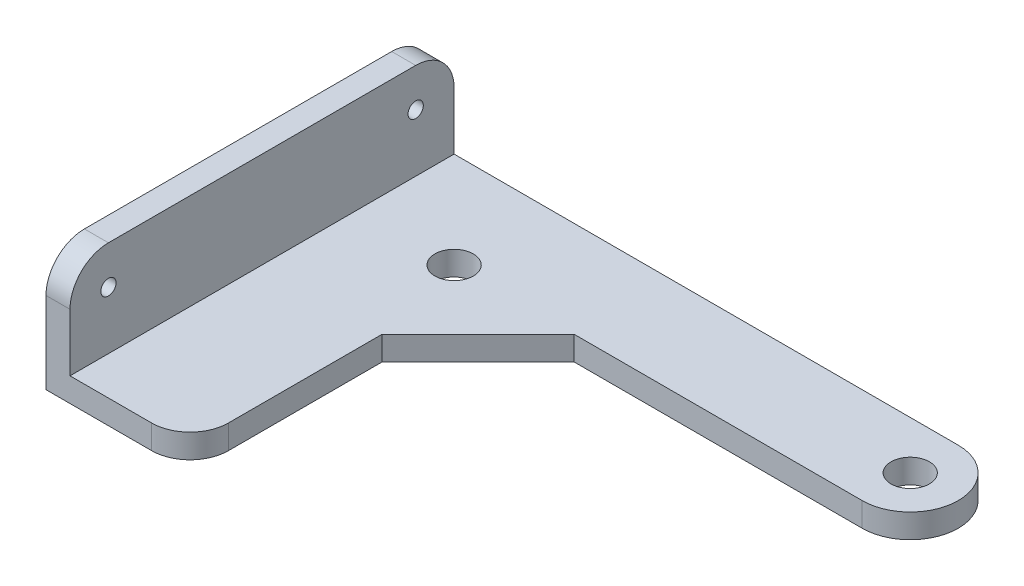
ISO-10303-21;
HEADER;
FILE_DESCRIPTION(('STEP AP214'),'2;1');
FILE_NAME('part.step','',(''),(''),'','','');
FILE_SCHEMA(('AUTOMOTIVE_DESIGN { 1 0 10303 214 1 1 1 1 }'));
ENDSEC;
DATA;
#1=APPLICATION_CONTEXT('core data for automotive mechanical design processes');
#2=APPLICATION_PROTOCOL_DEFINITION('international standard','automotive_design',2000,#1);
#3=PRODUCT_CONTEXT('',#1,'mechanical');
#4=PRODUCT('Part','Part','',(#3));
#5=PRODUCT_RELATED_PRODUCT_CATEGORY('part','',(#4));
#6=PRODUCT_DEFINITION_FORMATION('','',#4);
#7=PRODUCT_DEFINITION_CONTEXT('part definition',#1,'design');
#8=PRODUCT_DEFINITION('design','',#6,#7);
#9=PRODUCT_DEFINITION_SHAPE('','',#8);
#10=(LENGTH_UNIT() NAMED_UNIT(*) SI_UNIT(.MILLI.,.METRE.));
#11=(NAMED_UNIT(*) PLANE_ANGLE_UNIT() SI_UNIT($,.RADIAN.));
#12=(NAMED_UNIT(*) SI_UNIT($,.STERADIAN.) SOLID_ANGLE_UNIT());
#13=UNCERTAINTY_MEASURE_WITH_UNIT(LENGTH_MEASURE(1.E-05),#10,'distance_accuracy_value','');
#14=(GEOMETRIC_REPRESENTATION_CONTEXT(3) GLOBAL_UNCERTAINTY_ASSIGNED_CONTEXT((#13)) GLOBAL_UNIT_ASSIGNED_CONTEXT((#10,
#11,#12)) REPRESENTATION_CONTEXT('',''));
#15=CARTESIAN_POINT('',(0.,0.,0.));
#16=DIRECTION('',(0.,0.,1.));
#17=DIRECTION('',(1.,0.,0.));
#18=AXIS2_PLACEMENT_3D('',#15,#16,#17);
#19=CARTESIAN_POINT('',(0.,25.,-300.));
#20=DIRECTION('',(0.,0.,-1.));
#21=DIRECTION('',(-1.,0.,0.));
#22=AXIS2_PLACEMENT_3D('',#19,#20,#21);
#23=PLANE('',#22);
#24=DIRECTION('',(1.,0.,0.));
#25=VECTOR('',#24,1.);
#26=CARTESIAN_POINT('',(0.,0.,-300.));
#27=LINE('',#26,#25);
#28=CARTESIAN_POINT('',(250.,0.,-300.));
#29=VERTEX_POINT('',#28);
#30=CARTESIAN_POINT('',(550.,0.,-300.));
#31=VERTEX_POINT('',#30);
#32=EDGE_CURVE('E165',#29,#31,#27,.T.);
#33=ORIENTED_EDGE('',*,*,#32,.T.);
#34=DIRECTION('',(0.,-1.,0.));
#35=VECTOR('',#34,1.);
#36=CARTESIAN_POINT('',(550.,25.,-300.));
#37=LINE('',#36,#35);
#38=CARTESIAN_POINT('',(550.,25.,-300.));
#39=VERTEX_POINT('',#38);
#40=EDGE_CURVE('E198',#39,#31,#37,.T.);
#41=ORIENTED_EDGE('',*,*,#40,.F.);
#42=DIRECTION('',(1.,0.,0.));
#43=VECTOR('',#42,1.);
#44=CARTESIAN_POINT('',(0.,25.,-300.));
#45=LINE('',#44,#43);
#46=CARTESIAN_POINT('',(250.,25.,-300.));
#47=VERTEX_POINT('',#46);
#48=EDGE_CURVE('E166',#47,#39,#45,.T.);
#49=ORIENTED_EDGE('',*,*,#48,.F.);
#50=DIRECTION('',(0.,-1.,0.));
#51=VECTOR('',#50,1.);
#52=CARTESIAN_POINT('',(250.,25.,-300.));
#53=LINE('',#52,#51);
#54=EDGE_CURVE('E184',#47,#29,#53,.T.);
#55=ORIENTED_EDGE('',*,*,#54,.T.);
#56=EDGE_LOOP('',(#33,#41,#49,#55));
#57=FACE_BOUND('',#56,.T.);
#58=ADVANCED_FACE('F36',(#57),#23,.F.);
#59=CARTESIAN_POINT('',(550.,25.,-350.));
#60=DIRECTION('',(0.,-1.,0.));
#61=DIRECTION('',(0.,0.,-1.));
#62=AXIS2_PLACEMENT_3D('',#59,#60,#61);
#63=CYLINDRICAL_SURFACE('',#62,50.);
#64=CARTESIAN_POINT('',(550.,0.,-350.));
#65=DIRECTION('',(0.,1.,0.));
#66=DIRECTION('',(0.,0.,1.));
#67=AXIS2_PLACEMENT_3D('',#64,#65,#66);
#68=CIRCLE('',#67,50.);
#69=CARTESIAN_POINT('',(550.,0.,-400.));
#70=VERTEX_POINT('',#69);
#71=EDGE_CURVE('E144',#70,#31,#68,.F.);
#72=ORIENTED_EDGE('',*,*,#71,.F.);
#73=DIRECTION('',(0.,-1.,0.));
#74=VECTOR('',#73,1.);
#75=CARTESIAN_POINT('',(550.,25.,-400.));
#76=LINE('',#75,#74);
#77=CARTESIAN_POINT('',(550.,25.,-400.));
#78=VERTEX_POINT('',#77);
#79=EDGE_CURVE('E139',#78,#70,#76,.T.);
#80=ORIENTED_EDGE('',*,*,#79,.F.);
#81=CARTESIAN_POINT('',(550.,25.,-350.));
#82=DIRECTION('',(0.,1.,0.));
#83=DIRECTION('',(0.,0.,1.));
#84=AXIS2_PLACEMENT_3D('',#81,#82,#83);
#85=CIRCLE('',#84,50.);
#86=EDGE_CURVE('E168',#78,#39,#85,.F.);
#87=ORIENTED_EDGE('',*,*,#86,.T.);
#88=ORIENTED_EDGE('',*,*,#40,.T.);
#89=EDGE_LOOP('',(#72,#80,#87,#88));
#90=FACE_BOUND('',#89,.T.);
#91=ADVANCED_FACE('F252',(#90),#63,.T.);
#92=CARTESIAN_POINT('',(0.,25.,-400.));
#93=DIRECTION('',(0.,0.,-1.));
#94=DIRECTION('',(-1.,0.,0.));
#95=AXIS2_PLACEMENT_3D('',#92,#93,#94);
#96=PLANE('',#95);
#97=DIRECTION('',(0.,-1.,0.));
#98=VECTOR('',#97,1.);
#99=CARTESIAN_POINT('',(0.,125.,-400.));
#100=LINE('',#99,#98);
#101=CARTESIAN_POINT('',(0.,85.,-400.));
#102=VERTEX_POINT('',#101);
#103=CARTESIAN_POINT('',(0.,0.,-400.));
#104=VERTEX_POINT('',#103);
#105=EDGE_CURVE('E125',#102,#104,#100,.T.);
#106=ORIENTED_EDGE('',*,*,#105,.F.);
#107=DIRECTION('',(1.,0.,0.));
#108=VECTOR('',#107,1.);
#109=CARTESIAN_POINT('',(0.,85.,-400.));
#110=LINE('',#109,#108);
#111=CARTESIAN_POINT('',(25.,85.,-400.));
#112=VERTEX_POINT('',#111);
#113=EDGE_CURVE('E11',#102,#112,#110,.T.);
#114=ORIENTED_EDGE('',*,*,#113,.T.);
#115=DIRECTION('',(0.,-1.,0.));
#116=VECTOR('',#115,1.);
#117=CARTESIAN_POINT('',(25.,125.,-400.));
#118=LINE('',#117,#116);
#119=CARTESIAN_POINT('',(25.,25.,-400.));
#120=VERTEX_POINT('',#119);
#121=EDGE_CURVE('E132',#112,#120,#118,.T.);
#122=ORIENTED_EDGE('',*,*,#121,.T.);
#123=DIRECTION('',(1.,0.,0.));
#124=VECTOR('',#123,1.);
#125=CARTESIAN_POINT('',(0.,25.,-400.));
#126=LINE('',#125,#124);
#127=EDGE_CURVE('E172',#120,#78,#126,.T.);
#128=ORIENTED_EDGE('',*,*,#127,.T.);
#129=ORIENTED_EDGE('',*,*,#79,.T.);
#130=DIRECTION('',(1.,0.,0.));
#131=VECTOR('',#130,1.);
#132=CARTESIAN_POINT('',(0.,0.,-400.));
#133=LINE('',#132,#131);
#134=EDGE_CURVE('E136',#104,#70,#133,.T.);
#135=ORIENTED_EDGE('',*,*,#134,.F.);
#136=EDGE_LOOP('',(#106,#114,#122,#128,#129,#135));
#137=FACE_BOUND('',#136,.T.);
#138=ADVANCED_FACE('F137',(#137),#96,.T.);
#139=CARTESIAN_POINT('',(0.,25.,0.));
#140=DIRECTION('',(0.,0.,-1.));
#141=DIRECTION('',(-1.,0.,0.));
#142=AXIS2_PLACEMENT_3D('',#139,#140,#141);
#143=PLANE('',#142);
#144=DIRECTION('',(0.,-1.,0.));
#145=VECTOR('',#144,1.);
#146=CARTESIAN_POINT('',(25.,125.,0.));
#147=LINE('',#146,#145);
#148=CARTESIAN_POINT('',(25.,85.,0.));
#149=VERTEX_POINT('',#148);
#150=CARTESIAN_POINT('',(25.,25.,0.));
#151=VERTEX_POINT('',#150);
#152=EDGE_CURVE('E163',#149,#151,#147,.T.);
#153=ORIENTED_EDGE('',*,*,#152,.F.);
#154=DIRECTION('',(1.,0.,0.));
#155=VECTOR('',#154,1.);
#156=CARTESIAN_POINT('',(0.,85.,0.));
#157=LINE('',#156,#155);
#158=CARTESIAN_POINT('',(0.,85.,0.));
#159=VERTEX_POINT('',#158);
#160=EDGE_CURVE('E59',#149,#159,#157,.F.);
#161=ORIENTED_EDGE('',*,*,#160,.T.);
#162=DIRECTION('',(0.,-1.,0.));
#163=VECTOR('',#162,1.);
#164=CARTESIAN_POINT('',(0.,125.,0.));
#165=LINE('',#164,#163);
#166=CARTESIAN_POINT('',(0.,0.,0.));
#167=VERTEX_POINT('',#166);
#168=EDGE_CURVE('E133',#159,#167,#165,.T.);
#169=ORIENTED_EDGE('',*,*,#168,.T.);
#170=DIRECTION('',(1.,0.,0.));
#171=VECTOR('',#170,1.);
#172=CARTESIAN_POINT('',(0.,0.,0.));
#173=LINE('',#172,#171);
#174=CARTESIAN_POINT('',(110.,0.,0.));
#175=VERTEX_POINT('',#174);
#176=EDGE_CURVE('E143',#167,#175,#173,.T.);
#177=ORIENTED_EDGE('',*,*,#176,.T.);
#178=DIRECTION('',(0.,-1.,0.));
#179=VECTOR('',#178,1.);
#180=CARTESIAN_POINT('',(110.,25.,0.));
#181=LINE('',#180,#179);
#182=CARTESIAN_POINT('',(110.,25.,0.));
#183=VERTEX_POINT('',#182);
#184=EDGE_CURVE('E205',#175,#183,#181,.F.);
#185=ORIENTED_EDGE('',*,*,#184,.T.);
#186=DIRECTION('',(1.,0.,0.));
#187=VECTOR('',#186,1.);
#188=CARTESIAN_POINT('',(0.,25.,0.));
#189=LINE('',#188,#187);
#190=EDGE_CURVE('E177',#151,#183,#189,.T.);
#191=ORIENTED_EDGE('',*,*,#190,.F.);
#192=EDGE_LOOP('',(#153,#161,#169,#177,#185,#191));
#193=FACE_BOUND('',#192,.T.);
#194=ADVANCED_FACE('F231',(#193),#143,.F.);
#195=CARTESIAN_POINT('',(150.,25.,0.));
#196=DIRECTION('',(-1.,0.,0.));
#197=DIRECTION('',(0.,0.,1.));
#198=AXIS2_PLACEMENT_3D('',#195,#196,#197);
#199=PLANE('',#198);
#200=DIRECTION('',(0.,0.,-1.));
#201=VECTOR('',#200,1.);
#202=CARTESIAN_POINT('',(150.,25.,0.));
#203=LINE('',#202,#201);
#204=CARTESIAN_POINT('',(150.,25.,-40.));
#205=VERTEX_POINT('',#204);
#206=CARTESIAN_POINT('',(150.,25.,-200.));
#207=VERTEX_POINT('',#206);
#208=EDGE_CURVE('E180',#205,#207,#203,.T.);
#209=ORIENTED_EDGE('',*,*,#208,.F.);
#210=DIRECTION('',(0.,-1.,0.));
#211=VECTOR('',#210,1.);
#212=CARTESIAN_POINT('',(150.,25.,-40.));
#213=LINE('',#212,#211);
#214=CARTESIAN_POINT('',(150.,0.,-40.));
#215=VERTEX_POINT('',#214);
#216=EDGE_CURVE('E200',#205,#215,#213,.T.);
#217=ORIENTED_EDGE('',*,*,#216,.T.);
#218=DIRECTION('',(0.,0.,-1.));
#219=VECTOR('',#218,1.);
#220=CARTESIAN_POINT('',(150.,0.,0.));
#221=LINE('',#220,#219);
#222=CARTESIAN_POINT('',(150.,0.,-200.));
#223=VERTEX_POINT('',#222);
#224=EDGE_CURVE('E189',#215,#223,#221,.T.);
#225=ORIENTED_EDGE('',*,*,#224,.T.);
#226=DIRECTION('',(0.,-1.,0.));
#227=VECTOR('',#226,1.);
#228=CARTESIAN_POINT('',(150.,25.,-200.));
#229=LINE('',#228,#227);
#230=EDGE_CURVE('E194',#207,#223,#229,.T.);
#231=ORIENTED_EDGE('',*,*,#230,.F.);
#232=EDGE_LOOP('',(#209,#217,#225,#231));
#233=FACE_BOUND('',#232,.T.);
#234=ADVANCED_FACE('F277',(#233),#199,.F.);
#235=CARTESIAN_POINT('',(-25.0000000000003,25.,-25.0000000000004));
#236=DIRECTION('',(-0.707106781186546,0.,-0.707106781186549));
#237=DIRECTION('',(-0.707106781186549,0.,0.707106781186546));
#238=AXIS2_PLACEMENT_3D('',#235,#236,#237);
#239=PLANE('',#238);
#240=DIRECTION('',(0.707106781186549,0.,-0.707106781186546));
#241=VECTOR('',#240,1.);
#242=CARTESIAN_POINT('',(-25.0000000000003,0.,-25.0000000000004));
#243=LINE('',#242,#241);
#244=EDGE_CURVE('E169',#223,#29,#243,.T.);
#245=ORIENTED_EDGE('',*,*,#244,.T.);
#246=ORIENTED_EDGE('',*,*,#54,.F.);
#247=DIRECTION('',(0.707106781186549,0.,-0.707106781186546));
#248=VECTOR('',#247,1.);
#249=CARTESIAN_POINT('',(-25.0000000000003,25.,-25.0000000000004));
#250=LINE('',#249,#248);
#251=EDGE_CURVE('E182',#207,#47,#250,.T.);
#252=ORIENTED_EDGE('',*,*,#251,.F.);
#253=ORIENTED_EDGE('',*,*,#230,.T.);
#254=EDGE_LOOP('',(#245,#246,#252,#253));
#255=FACE_BOUND('',#254,.T.);
#256=ADVANCED_FACE('F282',(#255),#239,.F.);
#257=CARTESIAN_POINT('',(0.,25.,0.));
#258=DIRECTION('',(0.,1.,0.));
#259=DIRECTION('',(0.,0.,1.));
#260=AXIS2_PLACEMENT_3D('',#257,#258,#259);
#261=PLANE('',#260);
#262=CARTESIAN_POINT('',(125.,25.,-300.));
#263=DIRECTION('',(0.,1.,0.));
#264=DIRECTION('',(0.,0.,1.));
#265=AXIS2_PLACEMENT_3D('',#262,#263,#264);
#266=CIRCLE('',#265,20.);
#267=CARTESIAN_POINT('',(125.,25.,-280.));
#268=VERTEX_POINT('',#267);
#269=EDGE_CURVE('E157',#268,#268,#266,.T.);
#270=ORIENTED_EDGE('',*,*,#269,.F.);
#271=EDGE_LOOP('',(#270));
#272=FACE_BOUND('',#271,.T.);
#273=CARTESIAN_POINT('',(550.,25.,-350.));
#274=DIRECTION('',(0.,1.,0.));
#275=DIRECTION('',(0.,0.,1.));
#276=AXIS2_PLACEMENT_3D('',#273,#274,#275);
#277=CIRCLE('',#276,20.);
#278=CARTESIAN_POINT('',(550.,25.,-330.));
#279=VERTEX_POINT('',#278);
#280=EDGE_CURVE('E482',#279,#279,#277,.T.);
#281=ORIENTED_EDGE('',*,*,#280,.F.);
#282=EDGE_LOOP('',(#281));
#283=FACE_BOUND('',#282,.T.);
#284=ORIENTED_EDGE('',*,*,#190,.T.);
#285=CARTESIAN_POINT('',(110.,25.,-40.));
#286=DIRECTION('',(0.,1.,0.));
#287=DIRECTION('',(0.,0.,1.));
#288=AXIS2_PLACEMENT_3D('',#285,#286,#287);
#289=CIRCLE('',#288,40.);
#290=EDGE_CURVE('E207',#183,#205,#289,.T.);
#291=ORIENTED_EDGE('',*,*,#290,.T.);
#292=ORIENTED_EDGE('',*,*,#208,.T.);
#293=ORIENTED_EDGE('',*,*,#251,.T.);
#294=ORIENTED_EDGE('',*,*,#48,.T.);
#295=ORIENTED_EDGE('',*,*,#86,.F.);
#296=ORIENTED_EDGE('',*,*,#127,.F.);
#297=DIRECTION('',(0.,0.,-1.));
#298=VECTOR('',#297,1.);
#299=CARTESIAN_POINT('',(25.,25.,0.));
#300=LINE('',#299,#298);
#301=EDGE_CURVE('E174',#151,#120,#300,.T.);
#302=ORIENTED_EDGE('',*,*,#301,.F.);
#303=EDGE_LOOP('',(#284,#291,#292,#293,#294,#295,#296,#302));
#304=FACE_BOUND('',#303,.T.);
#305=ADVANCED_FACE('F237',(#272,#283,#304),#261,.T.);
#306=CARTESIAN_POINT('',(0.,0.,0.));
#307=DIRECTION('',(0.,1.,0.));
#308=DIRECTION('',(0.,0.,1.));
#309=AXIS2_PLACEMENT_3D('',#306,#307,#308);
#310=PLANE('',#309);
#311=CARTESIAN_POINT('',(125.,0.,-300.));
#312=DIRECTION('',(0.,1.,0.));
#313=DIRECTION('',(0.,0.,1.));
#314=AXIS2_PLACEMENT_3D('',#311,#312,#313);
#315=CIRCLE('',#314,20.);
#316=CARTESIAN_POINT('',(125.,0.,-280.));
#317=VERTEX_POINT('',#316);
#318=EDGE_CURVE('E151',#317,#317,#315,.T.);
#319=ORIENTED_EDGE('',*,*,#318,.T.);
#320=EDGE_LOOP('',(#319));
#321=FACE_BOUND('',#320,.T.);
#322=CARTESIAN_POINT('',(550.,0.,-350.));
#323=DIRECTION('',(0.,1.,0.));
#324=DIRECTION('',(0.,0.,1.));
#325=AXIS2_PLACEMENT_3D('',#322,#323,#324);
#326=CIRCLE('',#325,20.);
#327=CARTESIAN_POINT('',(550.,0.,-330.));
#328=VERTEX_POINT('',#327);
#329=EDGE_CURVE('E472',#328,#328,#326,.T.);
#330=ORIENTED_EDGE('',*,*,#329,.T.);
#331=EDGE_LOOP('',(#330));
#332=FACE_BOUND('',#331,.T.);
#333=ORIENTED_EDGE('',*,*,#224,.F.);
#334=CARTESIAN_POINT('',(110.,0.,-40.));
#335=DIRECTION('',(0.,1.,0.));
#336=DIRECTION('',(0.,0.,1.));
#337=AXIS2_PLACEMENT_3D('',#334,#335,#336);
#338=CIRCLE('',#337,40.);
#339=EDGE_CURVE('E203',#215,#175,#338,.F.);
#340=ORIENTED_EDGE('',*,*,#339,.T.);
#341=ORIENTED_EDGE('',*,*,#176,.F.);
#342=DIRECTION('',(0.,0.,-1.));
#343=VECTOR('',#342,1.);
#344=CARTESIAN_POINT('',(0.,0.,0.));
#345=LINE('',#344,#343);
#346=EDGE_CURVE('E129',#167,#104,#345,.T.);
#347=ORIENTED_EDGE('',*,*,#346,.T.);
#348=ORIENTED_EDGE('',*,*,#134,.T.);
#349=ORIENTED_EDGE('',*,*,#71,.T.);
#350=ORIENTED_EDGE('',*,*,#32,.F.);
#351=ORIENTED_EDGE('',*,*,#244,.F.);
#352=EDGE_LOOP('',(#333,#340,#341,#347,#348,#349,#350,#351));
#353=FACE_BOUND('',#352,.T.);
#354=ADVANCED_FACE('F148',(#321,#332,#353),#310,.F.);
#355=CARTESIAN_POINT('',(25.,125.,0.));
#356=DIRECTION('',(-1.,0.,0.));
#357=DIRECTION('',(0.,0.,1.));
#358=AXIS2_PLACEMENT_3D('',#355,#356,#357);
#359=PLANE('',#358);
#360=CARTESIAN_POINT('',(25.,85.,-40.));
#361=DIRECTION('',(1.,0.,0.));
#362=DIRECTION('',(0.,0.,-1.));
#363=AXIS2_PLACEMENT_3D('',#360,#361,#362);
#364=CIRCLE('',#363,7.94);
#365=CARTESIAN_POINT('',(25.,85.,-47.94));
#366=VERTEX_POINT('',#365);
#367=EDGE_CURVE('E469',#366,#366,#364,.T.);
#368=ORIENTED_EDGE('',*,*,#367,.F.);
#369=EDGE_LOOP('',(#368));
#370=FACE_BOUND('',#369,.T.);
#371=CARTESIAN_POINT('',(25.,85.,-360.));
#372=DIRECTION('',(1.,0.,0.));
#373=DIRECTION('',(0.,0.,1.));
#374=AXIS2_PLACEMENT_3D('',#371,#372,#373);
#375=CIRCLE('',#374,7.93999999999998);
#376=CARTESIAN_POINT('',(25.,85.,-352.06));
#377=VERTEX_POINT('',#376);
#378=EDGE_CURVE('E470',#377,#377,#375,.T.);
#379=ORIENTED_EDGE('',*,*,#378,.F.);
#380=EDGE_LOOP('',(#379));
#381=FACE_BOUND('',#380,.T.);
#382=DIRECTION('',(0.,0.,-1.));
#383=VECTOR('',#382,1.);
#384=CARTESIAN_POINT('',(25.,125.,0.));
#385=LINE('',#384,#383);
#386=CARTESIAN_POINT('',(25.,125.,-40.));
#387=VERTEX_POINT('',#386);
#388=CARTESIAN_POINT('',(25.,125.,-360.));
#389=VERTEX_POINT('',#388);
#390=EDGE_CURVE('E150',#387,#389,#385,.T.);
#391=ORIENTED_EDGE('',*,*,#390,.F.);
#392=CARTESIAN_POINT('',(25.,85.,-40.));
#393=DIRECTION('',(-1.,0.,0.));
#394=DIRECTION('',(0.,0.,1.));
#395=AXIS2_PLACEMENT_3D('',#392,#393,#394);
#396=CIRCLE('',#395,40.);
#397=EDGE_CURVE('E216',#387,#149,#396,.F.);
#398=ORIENTED_EDGE('',*,*,#397,.T.);
#399=ORIENTED_EDGE('',*,*,#152,.T.);
#400=ORIENTED_EDGE('',*,*,#301,.T.);
#401=ORIENTED_EDGE('',*,*,#121,.F.);
#402=CARTESIAN_POINT('',(25.,85.,-360.));
#403=DIRECTION('',(-1.,0.,0.));
#404=DIRECTION('',(0.,0.,1.));
#405=AXIS2_PLACEMENT_3D('',#402,#403,#404);
#406=CIRCLE('',#405,40.);
#407=EDGE_CURVE('E214',#112,#389,#406,.F.);
#408=ORIENTED_EDGE('',*,*,#407,.T.);
#409=EDGE_LOOP('',(#391,#398,#399,#400,#401,#408));
#410=FACE_BOUND('',#409,.T.);
#411=ADVANCED_FACE('F229',(#370,#381,#410),#359,.F.);
#412=CARTESIAN_POINT('',(0.,125.,0.));
#413=DIRECTION('',(-1.,0.,0.));
#414=DIRECTION('',(0.,0.,1.));
#415=AXIS2_PLACEMENT_3D('',#412,#413,#414);
#416=PLANE('',#415);
#417=CARTESIAN_POINT('',(0.,85.,-40.));
#418=DIRECTION('',(1.,0.,0.));
#419=DIRECTION('',(0.,0.,-1.));
#420=AXIS2_PLACEMENT_3D('',#417,#418,#419);
#421=CIRCLE('',#420,7.94);
#422=CARTESIAN_POINT('',(0.,85.,-47.94));
#423=VERTEX_POINT('',#422);
#424=EDGE_CURVE('E466',#423,#423,#421,.T.);
#425=ORIENTED_EDGE('',*,*,#424,.T.);
#426=EDGE_LOOP('',(#425));
#427=FACE_BOUND('',#426,.T.);
#428=CARTESIAN_POINT('',(0.,85.,-360.));
#429=DIRECTION('',(1.,0.,0.));
#430=DIRECTION('',(0.,0.,1.));
#431=AXIS2_PLACEMENT_3D('',#428,#429,#430);
#432=CIRCLE('',#431,7.93999999999998);
#433=CARTESIAN_POINT('',(0.,85.,-352.06));
#434=VERTEX_POINT('',#433);
#435=EDGE_CURVE('E475',#434,#434,#432,.T.);
#436=ORIENTED_EDGE('',*,*,#435,.T.);
#437=EDGE_LOOP('',(#436));
#438=FACE_BOUND('',#437,.T.);
#439=ORIENTED_EDGE('',*,*,#168,.F.);
#440=CARTESIAN_POINT('',(0.,85.,-40.));
#441=DIRECTION('',(-1.,0.,0.));
#442=DIRECTION('',(0.,0.,1.));
#443=AXIS2_PLACEMENT_3D('',#440,#441,#442);
#444=CIRCLE('',#443,40.);
#445=CARTESIAN_POINT('',(0.,125.,-40.));
#446=VERTEX_POINT('',#445);
#447=EDGE_CURVE('E44',#159,#446,#444,.T.);
#448=ORIENTED_EDGE('',*,*,#447,.T.);
#449=DIRECTION('',(0.,0.,-1.));
#450=VECTOR('',#449,1.);
#451=CARTESIAN_POINT('',(0.,125.,0.));
#452=LINE('',#451,#450);
#453=CARTESIAN_POINT('',(0.,125.,-360.));
#454=VERTEX_POINT('',#453);
#455=EDGE_CURVE('E154',#446,#454,#452,.T.);
#456=ORIENTED_EDGE('',*,*,#455,.T.);
#457=CARTESIAN_POINT('',(0.,85.,-360.));
#458=DIRECTION('',(-1.,0.,0.));
#459=DIRECTION('',(0.,0.,1.));
#460=AXIS2_PLACEMENT_3D('',#457,#458,#459);
#461=CIRCLE('',#460,40.);
#462=EDGE_CURVE('E51',#454,#102,#461,.T.);
#463=ORIENTED_EDGE('',*,*,#462,.T.);
#464=ORIENTED_EDGE('',*,*,#105,.T.);
#465=ORIENTED_EDGE('',*,*,#346,.F.);
#466=EDGE_LOOP('',(#439,#448,#456,#463,#464,#465));
#467=FACE_BOUND('',#466,.T.);
#468=ADVANCED_FACE('F127',(#427,#438,#467),#416,.T.);
#469=CARTESIAN_POINT('',(0.,125.,0.));
#470=DIRECTION('',(0.,1.,0.));
#471=DIRECTION('',(0.,0.,1.));
#472=AXIS2_PLACEMENT_3D('',#469,#470,#471);
#473=PLANE('',#472);
#474=ORIENTED_EDGE('',*,*,#455,.F.);
#475=DIRECTION('',(1.,0.,0.));
#476=VECTOR('',#475,1.);
#477=CARTESIAN_POINT('',(25.,125.,-40.));
#478=LINE('',#477,#476);
#479=EDGE_CURVE('E211',#446,#387,#478,.T.);
#480=ORIENTED_EDGE('',*,*,#479,.T.);
#481=ORIENTED_EDGE('',*,*,#390,.T.);
#482=DIRECTION('',(1.,0.,0.));
#483=VECTOR('',#482,1.);
#484=CARTESIAN_POINT('',(0.,125.,-360.));
#485=LINE('',#484,#483);
#486=EDGE_CURVE('E209',#389,#454,#485,.F.);
#487=ORIENTED_EDGE('',*,*,#486,.T.);
#488=EDGE_LOOP('',(#474,#480,#481,#487));
#489=FACE_BOUND('',#488,.T.);
#490=ADVANCED_FACE('F224',(#489),#473,.T.);
#491=CARTESIAN_POINT('',(110.,25.,-40.));
#492=DIRECTION('',(0.,-1.,0.));
#493=DIRECTION('',(0.,0.,-1.));
#494=AXIS2_PLACEMENT_3D('',#491,#492,#493);
#495=CYLINDRICAL_SURFACE('',#494,40.);
#496=ORIENTED_EDGE('',*,*,#290,.F.);
#497=ORIENTED_EDGE('',*,*,#184,.F.);
#498=ORIENTED_EDGE('',*,*,#339,.F.);
#499=ORIENTED_EDGE('',*,*,#216,.F.);
#500=EDGE_LOOP('',(#496,#497,#498,#499));
#501=FACE_BOUND('',#500,.T.);
#502=ADVANCED_FACE('F262',(#501),#495,.T.);
#503=CARTESIAN_POINT('',(550.,0.,-350.));
#504=DIRECTION('',(0.,1.,0.));
#505=DIRECTION('',(0.,0.,1.));
#506=AXIS2_PLACEMENT_3D('',#503,#504,#505);
#507=CYLINDRICAL_SURFACE('',#506,20.);
#508=ORIENTED_EDGE('',*,*,#329,.F.);
#509=EDGE_LOOP('',(#508));
#510=FACE_BOUND('',#509,.T.);
#511=ORIENTED_EDGE('',*,*,#280,.T.);
#512=EDGE_LOOP('',(#511));
#513=FACE_BOUND('',#512,.T.);
#514=ADVANCED_FACE('F264',(#510,#513),#507,.F.);
#515=CARTESIAN_POINT('',(125.,0.,-300.));
#516=DIRECTION('',(0.,1.,0.));
#517=DIRECTION('',(0.,0.,1.));
#518=AXIS2_PLACEMENT_3D('',#515,#516,#517);
#519=CYLINDRICAL_SURFACE('',#518,20.);
#520=ORIENTED_EDGE('',*,*,#318,.F.);
#521=EDGE_LOOP('',(#520));
#522=FACE_BOUND('',#521,.T.);
#523=ORIENTED_EDGE('',*,*,#269,.T.);
#524=EDGE_LOOP('',(#523));
#525=FACE_BOUND('',#524,.T.);
#526=ADVANCED_FACE('F250',(#522,#525),#519,.F.);
#527=CARTESIAN_POINT('',(0.,85.,-40.));
#528=DIRECTION('',(-1.,0.,0.));
#529=DIRECTION('',(0.,0.,1.));
#530=AXIS2_PLACEMENT_3D('',#527,#528,#529);
#531=CYLINDRICAL_SURFACE('',#530,40.);
#532=ORIENTED_EDGE('',*,*,#447,.F.);
#533=ORIENTED_EDGE('',*,*,#160,.F.);
#534=ORIENTED_EDGE('',*,*,#397,.F.);
#535=ORIENTED_EDGE('',*,*,#479,.F.);
#536=EDGE_LOOP('',(#532,#533,#534,#535));
#537=FACE_BOUND('',#536,.T.);
#538=ADVANCED_FACE('F227',(#537),#531,.T.);
#539=CARTESIAN_POINT('',(0.,85.,-360.));
#540=DIRECTION('',(1.,0.,0.));
#541=DIRECTION('',(0.,0.,-1.));
#542=AXIS2_PLACEMENT_3D('',#539,#540,#541);
#543=CYLINDRICAL_SURFACE('',#542,40.);
#544=ORIENTED_EDGE('',*,*,#462,.F.);
#545=ORIENTED_EDGE('',*,*,#486,.F.);
#546=ORIENTED_EDGE('',*,*,#407,.F.);
#547=ORIENTED_EDGE('',*,*,#113,.F.);
#548=EDGE_LOOP('',(#544,#545,#546,#547));
#549=FACE_BOUND('',#548,.T.);
#550=ADVANCED_FACE('F38',(#549),#543,.T.);
#551=CARTESIAN_POINT('',(0.,85.,-360.));
#552=DIRECTION('',(1.,0.,0.));
#553=DIRECTION('',(0.,0.,-1.));
#554=AXIS2_PLACEMENT_3D('',#551,#552,#553);
#555=CYLINDRICAL_SURFACE('',#554,7.93999999999998);
#556=ORIENTED_EDGE('',*,*,#435,.F.);
#557=EDGE_LOOP('',(#556));
#558=FACE_BOUND('',#557,.T.);
#559=ORIENTED_EDGE('',*,*,#378,.T.);
#560=EDGE_LOOP('',(#559));
#561=FACE_BOUND('',#560,.T.);
#562=ADVANCED_FACE('F242',(#558,#561),#555,.F.);
#563=CARTESIAN_POINT('',(0.,85.,-40.));
#564=DIRECTION('',(1.,0.,0.));
#565=DIRECTION('',(0.,0.,-1.));
#566=AXIS2_PLACEMENT_3D('',#563,#564,#565);
#567=CYLINDRICAL_SURFACE('',#566,7.94);
#568=ORIENTED_EDGE('',*,*,#424,.F.);
#569=EDGE_LOOP('',(#568));
#570=FACE_BOUND('',#569,.T.);
#571=ORIENTED_EDGE('',*,*,#367,.T.);
#572=EDGE_LOOP('',(#571));
#573=FACE_BOUND('',#572,.T.);
#574=ADVANCED_FACE('F247',(#570,#573),#567,.F.);
#575=CLOSED_SHELL('',(#58,#91,#138,#194,#234,#256,#305,#354,#411,#468,#490,#502,#514,#526,#538,
#550,#562,#574));
#576=MANIFOLD_SOLID_BREP('B2',#575);
#577=ADVANCED_BREP_SHAPE_REPRESENTATION('',(#18,#576),#14);
#578=SHAPE_DEFINITION_REPRESENTATION(#9,#577);
ENDSEC;
END-ISO-10303-21;
